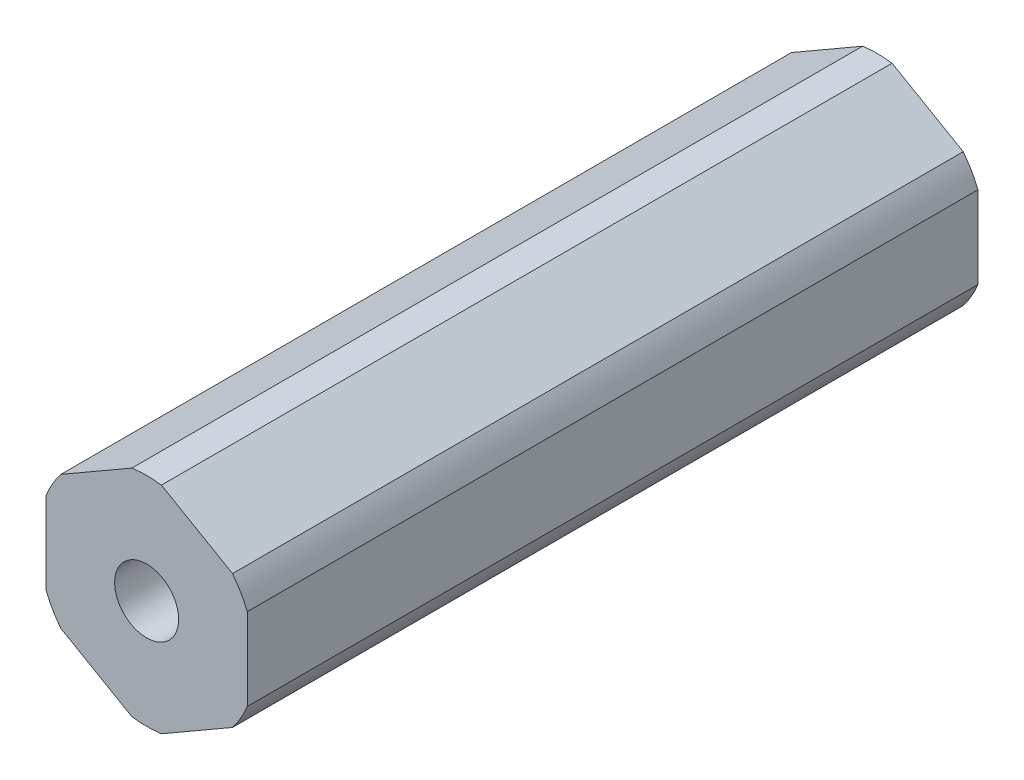
ISO-10303-21;
HEADER;
FILE_DESCRIPTION(('STEP AP214'),'2;1');
FILE_NAME('part.step','',(''),(''),'','','');
FILE_SCHEMA(('AUTOMOTIVE_DESIGN { 1 0 10303 214 1 1 1 1 }'));
ENDSEC;
DATA;
#1=APPLICATION_CONTEXT('core data for automotive mechanical design processes');
#2=APPLICATION_PROTOCOL_DEFINITION('international standard','automotive_design',2000,#1);
#3=PRODUCT_CONTEXT('',#1,'mechanical');
#4=PRODUCT('Part','Part','',(#3));
#5=PRODUCT_RELATED_PRODUCT_CATEGORY('part','',(#4));
#6=PRODUCT_DEFINITION_FORMATION('','',#4);
#7=PRODUCT_DEFINITION_CONTEXT('part definition',#1,'design');
#8=PRODUCT_DEFINITION('design','',#6,#7);
#9=PRODUCT_DEFINITION_SHAPE('','',#8);
#10=(LENGTH_UNIT() NAMED_UNIT(*) SI_UNIT(.MILLI.,.METRE.));
#11=(NAMED_UNIT(*) PLANE_ANGLE_UNIT() SI_UNIT($,.RADIAN.));
#12=(NAMED_UNIT(*) SI_UNIT($,.STERADIAN.) SOLID_ANGLE_UNIT());
#13=UNCERTAINTY_MEASURE_WITH_UNIT(LENGTH_MEASURE(1.E-05),#10,'distance_accuracy_value','');
#14=(GEOMETRIC_REPRESENTATION_CONTEXT(3) GLOBAL_UNCERTAINTY_ASSIGNED_CONTEXT((#13)) GLOBAL_UNIT_ASSIGNED_CONTEXT((#10,
#11,#12)) REPRESENTATION_CONTEXT('',''));
#15=CARTESIAN_POINT('',(0.,0.,0.));
#16=DIRECTION('',(0.,0.,1.));
#17=DIRECTION('',(1.,0.,0.));
#18=AXIS2_PLACEMENT_3D('',#15,#16,#17);
#19=CARTESIAN_POINT('',(0.,0.,46.101));
#20=DIRECTION('',(0.,0.,-1.));
#21=DIRECTION('',(-1.,0.,0.));
#22=AXIS2_PLACEMENT_3D('',#19,#20,#21);
#23=CYLINDRICAL_SURFACE('',#22,6.858);
#24=CARTESIAN_POINT('',(0.,0.,0.));
#25=DIRECTION('',(0.,0.,1.));
#26=DIRECTION('',(1.,0.,0.));
#27=AXIS2_PLACEMENT_3D('',#24,#25,#26);
#28=CIRCLE('',#27,6.858);
#29=CARTESIAN_POINT('',(-6.34999999999999,-2.59030191290516,0.));
#30=VERTEX_POINT('',#29);
#31=CARTESIAN_POINT('',(-5.41826726004726,-4.20411035757864,0.));
#32=VERTEX_POINT('',#31);
#33=EDGE_CURVE('E170',#30,#32,#28,.T.);
#34=ORIENTED_EDGE('',*,*,#33,.T.);
#35=DIRECTION('',(0.,0.,-1.));
#36=VECTOR('',#35,1.);
#37=CARTESIAN_POINT('',(-5.41826726004726,-4.20411035757864,46.101));
#38=LINE('',#37,#36);
#39=CARTESIAN_POINT('',(-5.41826726004726,-4.20411035757864,46.101));
#40=VERTEX_POINT('',#39);
#41=EDGE_CURVE('E11',#40,#32,#38,.T.);
#42=ORIENTED_EDGE('',*,*,#41,.F.);
#43=CARTESIAN_POINT('',(0.,0.,46.101));
#44=DIRECTION('',(0.,0.,1.));
#45=DIRECTION('',(1.,0.,0.));
#46=AXIS2_PLACEMENT_3D('',#43,#44,#45);
#47=CIRCLE('',#46,6.858);
#48=CARTESIAN_POINT('',(-6.34999999999999,-2.59030191290516,46.101));
#49=VERTEX_POINT('',#48);
#50=EDGE_CURVE('E205',#49,#40,#47,.T.);
#51=ORIENTED_EDGE('',*,*,#50,.F.);
#52=DIRECTION('',(0.,0.,-1.));
#53=VECTOR('',#52,1.);
#54=CARTESIAN_POINT('',(-6.34999999999999,-2.59030191290516,46.101));
#55=LINE('',#54,#53);
#56=EDGE_CURVE('E166',#49,#30,#55,.T.);
#57=ORIENTED_EDGE('',*,*,#56,.T.);
#58=EDGE_LOOP('',(#34,#42,#51,#57));
#59=FACE_BOUND('',#58,.T.);
#60=ADVANCED_FACE('F45',(#59),#23,.T.);
#61=CARTESIAN_POINT('',(-5.41826726004726,-4.20411035757864,46.101));
#62=DIRECTION('',(0.499999999999995,0.866025403784442,0.));
#63=DIRECTION('',(-0.866025403784442,0.499999999999995,0.));
#64=AXIS2_PLACEMENT_3D('',#61,#62,#63);
#65=PLANE('',#64);
#66=DIRECTION('',(0.866025403784442,-0.499999999999995,0.));
#67=VECTOR('',#66,1.);
#68=CARTESIAN_POINT('',(-5.41826726004726,-4.20411035757864,0.));
#69=LINE('',#68,#67);
#70=CARTESIAN_POINT('',(-0.931732739952676,-6.79441227048376,0.));
#71=VERTEX_POINT('',#70);
#72=EDGE_CURVE('E174',#32,#71,#69,.T.);
#73=ORIENTED_EDGE('',*,*,#72,.T.);
#74=DIRECTION('',(0.,0.,-1.));
#75=VECTOR('',#74,1.);
#76=CARTESIAN_POINT('',(-0.931732739952676,-6.79441227048376,46.101));
#77=LINE('',#76,#75);
#78=CARTESIAN_POINT('',(-0.931732739952676,-6.79441227048376,46.101));
#79=VERTEX_POINT('',#78);
#80=EDGE_CURVE('E54',#79,#71,#77,.T.);
#81=ORIENTED_EDGE('',*,*,#80,.F.);
#82=DIRECTION('',(0.866025403784442,-0.499999999999995,0.));
#83=VECTOR('',#82,1.);
#84=CARTESIAN_POINT('',(-5.41826726004726,-4.20411035757864,46.101));
#85=LINE('',#84,#83);
#86=EDGE_CURVE('E117',#40,#79,#85,.T.);
#87=ORIENTED_EDGE('',*,*,#86,.F.);
#88=ORIENTED_EDGE('',*,*,#41,.T.);
#89=EDGE_LOOP('',(#73,#81,#87,#88));
#90=FACE_BOUND('',#89,.T.);
#91=ADVANCED_FACE('F300',(#90),#65,.F.);
#92=CARTESIAN_POINT('',(0.,0.,46.101));
#93=DIRECTION('',(0.,0.,-1.));
#94=DIRECTION('',(-1.,0.,0.));
#95=AXIS2_PLACEMENT_3D('',#92,#93,#94);
#96=CYLINDRICAL_SURFACE('',#95,6.858);
#97=CARTESIAN_POINT('',(0.,0.,0.));
#98=DIRECTION('',(0.,0.,1.));
#99=DIRECTION('',(1.,0.,0.));
#100=AXIS2_PLACEMENT_3D('',#97,#98,#99);
#101=CIRCLE('',#100,6.858);
#102=CARTESIAN_POINT('',(0.931732739952767,-6.79441227048375,0.));
#103=VERTEX_POINT('',#102);
#104=EDGE_CURVE('E178',#71,#103,#101,.T.);
#105=ORIENTED_EDGE('',*,*,#104,.T.);
#106=DIRECTION('',(0.,0.,-1.));
#107=VECTOR('',#106,1.);
#108=CARTESIAN_POINT('',(0.931732739952767,-6.79441227048375,46.101));
#109=LINE('',#108,#107);
#110=CARTESIAN_POINT('',(0.931732739952767,-6.79441227048375,46.101));
#111=VERTEX_POINT('',#110);
#112=EDGE_CURVE('E232',#111,#103,#109,.T.);
#113=ORIENTED_EDGE('',*,*,#112,.F.);
#114=CARTESIAN_POINT('',(0.,0.,46.101));
#115=DIRECTION('',(0.,0.,1.));
#116=DIRECTION('',(1.,0.,0.));
#117=AXIS2_PLACEMENT_3D('',#114,#115,#116);
#118=CIRCLE('',#117,6.858);
#119=EDGE_CURVE('E242',#79,#111,#118,.T.);
#120=ORIENTED_EDGE('',*,*,#119,.F.);
#121=ORIENTED_EDGE('',*,*,#80,.T.);
#122=EDGE_LOOP('',(#105,#113,#120,#121));
#123=FACE_BOUND('',#122,.T.);
#124=ADVANCED_FACE('F240',(#123),#96,.T.);
#125=CARTESIAN_POINT('',(0.931732739952769,-6.79441227048375,46.101));
#126=DIRECTION('',(-0.500000000000007,0.866025403784435,0.));
#127=DIRECTION('',(-0.866025403784435,-0.500000000000007,0.));
#128=AXIS2_PLACEMENT_3D('',#125,#126,#127);
#129=PLANE('',#128);
#130=DIRECTION('',(0.866025403784434,0.500000000000007,0.));
#131=VECTOR('',#130,1.);
#132=CARTESIAN_POINT('',(0.931732739952769,-6.79441227048375,0.));
#133=LINE('',#132,#131);
#134=CARTESIAN_POINT('',(5.41826726004732,-4.20411035757856,0.));
#135=VERTEX_POINT('',#134);
#136=EDGE_CURVE('E181',#103,#135,#133,.T.);
#137=ORIENTED_EDGE('',*,*,#136,.T.);
#138=DIRECTION('',(0.,0.,-1.));
#139=VECTOR('',#138,1.);
#140=CARTESIAN_POINT('',(5.41826726004732,-4.20411035757856,46.101));
#141=LINE('',#140,#139);
#142=CARTESIAN_POINT('',(5.41826726004732,-4.20411035757856,46.101));
#143=VERTEX_POINT('',#142);
#144=EDGE_CURVE('E228',#143,#135,#141,.T.);
#145=ORIENTED_EDGE('',*,*,#144,.F.);
#146=DIRECTION('',(0.866025403784434,0.500000000000007,0.));
#147=VECTOR('',#146,1.);
#148=CARTESIAN_POINT('',(0.931732739952769,-6.79441227048375,46.101));
#149=LINE('',#148,#147);
#150=EDGE_CURVE('E261',#111,#143,#149,.T.);
#151=ORIENTED_EDGE('',*,*,#150,.F.);
#152=ORIENTED_EDGE('',*,*,#112,.T.);
#153=EDGE_LOOP('',(#137,#145,#151,#152));
#154=FACE_BOUND('',#153,.T.);
#155=ADVANCED_FACE('F251',(#154),#129,.F.);
#156=CARTESIAN_POINT('',(0.,0.,46.101));
#157=DIRECTION('',(0.,0.,-1.));
#158=DIRECTION('',(-1.,0.,0.));
#159=AXIS2_PLACEMENT_3D('',#156,#157,#158);
#160=CYLINDRICAL_SURFACE('',#159,6.858);
#161=CARTESIAN_POINT('',(0.,0.,0.));
#162=DIRECTION('',(0.,0.,1.));
#163=DIRECTION('',(1.,0.,0.));
#164=AXIS2_PLACEMENT_3D('',#161,#162,#163);
#165=CIRCLE('',#164,6.858);
#166=CARTESIAN_POINT('',(6.35000000000002,-2.59030191290508,0.));
#167=VERTEX_POINT('',#166);
#168=EDGE_CURVE('E184',#135,#167,#165,.T.);
#169=ORIENTED_EDGE('',*,*,#168,.T.);
#170=DIRECTION('',(0.,0.,-1.));
#171=VECTOR('',#170,1.);
#172=CARTESIAN_POINT('',(6.35000000000002,-2.59030191290508,46.101));
#173=LINE('',#172,#171);
#174=CARTESIAN_POINT('',(6.35000000000002,-2.59030191290508,46.101));
#175=VERTEX_POINT('',#174);
#176=EDGE_CURVE('E224',#175,#167,#173,.T.);
#177=ORIENTED_EDGE('',*,*,#176,.F.);
#178=CARTESIAN_POINT('',(0.,0.,46.101));
#179=DIRECTION('',(0.,0.,1.));
#180=DIRECTION('',(1.,0.,0.));
#181=AXIS2_PLACEMENT_3D('',#178,#179,#180);
#182=CIRCLE('',#181,6.858);
#183=EDGE_CURVE('E257',#143,#175,#182,.T.);
#184=ORIENTED_EDGE('',*,*,#183,.F.);
#185=ORIENTED_EDGE('',*,*,#144,.T.);
#186=EDGE_LOOP('',(#169,#177,#184,#185));
#187=FACE_BOUND('',#186,.T.);
#188=ADVANCED_FACE('F255',(#187),#160,.T.);
#189=CARTESIAN_POINT('',(6.35000000000002,-2.59030191290508,46.101));
#190=DIRECTION('',(-1.,0.,0.));
#191=DIRECTION('',(0.,-1.,0.));
#192=AXIS2_PLACEMENT_3D('',#189,#190,#191);
#193=PLANE('',#192);
#194=DIRECTION('',(0.,1.,0.));
#195=VECTOR('',#194,1.);
#196=CARTESIAN_POINT('',(6.35000000000002,-2.59030191290508,0.));
#197=LINE('',#196,#195);
#198=CARTESIAN_POINT('',(6.34999999999997,2.59030191290521,0.));
#199=VERTEX_POINT('',#198);
#200=EDGE_CURVE('E187',#167,#199,#197,.T.);
#201=ORIENTED_EDGE('',*,*,#200,.T.);
#202=DIRECTION('',(0.,0.,-1.));
#203=VECTOR('',#202,1.);
#204=CARTESIAN_POINT('',(6.34999999999997,2.59030191290521,46.101));
#205=LINE('',#204,#203);
#206=CARTESIAN_POINT('',(6.34999999999997,2.59030191290521,46.101));
#207=VERTEX_POINT('',#206);
#208=EDGE_CURVE('E220',#207,#199,#205,.T.);
#209=ORIENTED_EDGE('',*,*,#208,.F.);
#210=DIRECTION('',(0.,1.,0.));
#211=VECTOR('',#210,1.);
#212=CARTESIAN_POINT('',(6.35000000000002,-2.59030191290508,46.101));
#213=LINE('',#212,#211);
#214=EDGE_CURVE('E260',#175,#207,#213,.T.);
#215=ORIENTED_EDGE('',*,*,#214,.F.);
#216=ORIENTED_EDGE('',*,*,#176,.T.);
#217=EDGE_LOOP('',(#201,#209,#215,#216));
#218=FACE_BOUND('',#217,.T.);
#219=ADVANCED_FACE('F313',(#218),#193,.F.);
#220=CARTESIAN_POINT('',(0.,0.,46.101));
#221=DIRECTION('',(0.,0.,-1.));
#222=DIRECTION('',(-1.,0.,0.));
#223=AXIS2_PLACEMENT_3D('',#220,#221,#222);
#224=CYLINDRICAL_SURFACE('',#223,6.858);
#225=CARTESIAN_POINT('',(0.,0.,0.));
#226=DIRECTION('',(0.,0.,1.));
#227=DIRECTION('',(1.,0.,0.));
#228=AXIS2_PLACEMENT_3D('',#225,#226,#227);
#229=CIRCLE('',#228,6.858);
#230=CARTESIAN_POINT('',(5.41826726004721,4.2041103575787,0.));
#231=VERTEX_POINT('',#230);
#232=EDGE_CURVE('E190',#199,#231,#229,.T.);
#233=ORIENTED_EDGE('',*,*,#232,.T.);
#234=DIRECTION('',(0.,0.,-1.));
#235=VECTOR('',#234,1.);
#236=CARTESIAN_POINT('',(5.41826726004721,4.2041103575787,46.101));
#237=LINE('',#236,#235);
#238=CARTESIAN_POINT('',(5.41826726004721,4.2041103575787,46.101));
#239=VERTEX_POINT('',#238);
#240=EDGE_CURVE('E216',#239,#231,#237,.T.);
#241=ORIENTED_EDGE('',*,*,#240,.F.);
#242=CARTESIAN_POINT('',(0.,0.,46.101));
#243=DIRECTION('',(0.,0.,1.));
#244=DIRECTION('',(1.,0.,0.));
#245=AXIS2_PLACEMENT_3D('',#242,#243,#244);
#246=CIRCLE('',#245,6.858);
#247=EDGE_CURVE('E265',#207,#239,#246,.T.);
#248=ORIENTED_EDGE('',*,*,#247,.F.);
#249=ORIENTED_EDGE('',*,*,#208,.T.);
#250=EDGE_LOOP('',(#233,#241,#248,#249));
#251=FACE_BOUND('',#250,.T.);
#252=ADVANCED_FACE('F316',(#251),#224,.T.);
#253=CARTESIAN_POINT('',(5.41826726004722,4.2041103575787,46.101));
#254=DIRECTION('',(-0.499999999999995,-0.866025403784442,0.));
#255=DIRECTION('',(0.866025403784442,-0.499999999999995,0.));
#256=AXIS2_PLACEMENT_3D('',#253,#254,#255);
#257=PLANE('',#256);
#258=DIRECTION('',(-0.866025403784442,0.499999999999995,0.));
#259=VECTOR('',#258,1.);
#260=CARTESIAN_POINT('',(5.41826726004722,4.2041103575787,0.));
#261=LINE('',#260,#259);
#262=CARTESIAN_POINT('',(0.931732739952745,6.79441227048375,0.));
#263=VERTEX_POINT('',#262);
#264=EDGE_CURVE('E193',#231,#263,#261,.T.);
#265=ORIENTED_EDGE('',*,*,#264,.T.);
#266=DIRECTION('',(0.,0.,-1.));
#267=VECTOR('',#266,1.);
#268=CARTESIAN_POINT('',(0.931732739952745,6.79441227048375,46.101));
#269=LINE('',#268,#267);
#270=CARTESIAN_POINT('',(0.931732739952745,6.79441227048375,46.101));
#271=VERTEX_POINT('',#270);
#272=EDGE_CURVE('E212',#271,#263,#269,.T.);
#273=ORIENTED_EDGE('',*,*,#272,.F.);
#274=DIRECTION('',(-0.866025403784442,0.499999999999995,0.));
#275=VECTOR('',#274,1.);
#276=CARTESIAN_POINT('',(5.41826726004722,4.2041103575787,46.101));
#277=LINE('',#276,#275);
#278=EDGE_CURVE('E272',#239,#271,#277,.T.);
#279=ORIENTED_EDGE('',*,*,#278,.F.);
#280=ORIENTED_EDGE('',*,*,#240,.T.);
#281=EDGE_LOOP('',(#265,#273,#279,#280));
#282=FACE_BOUND('',#281,.T.);
#283=ADVANCED_FACE('F280',(#282),#257,.F.);
#284=CARTESIAN_POINT('',(0.,0.,46.101));
#285=DIRECTION('',(0.,0.,-1.));
#286=DIRECTION('',(-1.,0.,0.));
#287=AXIS2_PLACEMENT_3D('',#284,#285,#286);
#288=CYLINDRICAL_SURFACE('',#287,6.858);
#289=CARTESIAN_POINT('',(0.,0.,0.));
#290=DIRECTION('',(0.,0.,1.));
#291=DIRECTION('',(1.,0.,0.));
#292=AXIS2_PLACEMENT_3D('',#289,#290,#291);
#293=CIRCLE('',#292,6.858);
#294=CARTESIAN_POINT('',(-0.931732739952723,6.79441227048375,0.));
#295=VERTEX_POINT('',#294);
#296=EDGE_CURVE('E196',#263,#295,#293,.T.);
#297=ORIENTED_EDGE('',*,*,#296,.T.);
#298=DIRECTION('',(0.,0.,-1.));
#299=VECTOR('',#298,1.);
#300=CARTESIAN_POINT('',(-0.931732739952723,6.79441227048375,46.101));
#301=LINE('',#300,#299);
#302=CARTESIAN_POINT('',(-0.931732739952723,6.79441227048375,46.101));
#303=VERTEX_POINT('',#302);
#304=EDGE_CURVE('E159',#303,#295,#301,.T.);
#305=ORIENTED_EDGE('',*,*,#304,.F.);
#306=CARTESIAN_POINT('',(0.,0.,46.101));
#307=DIRECTION('',(0.,0.,1.));
#308=DIRECTION('',(1.,0.,0.));
#309=AXIS2_PLACEMENT_3D('',#306,#307,#308);
#310=CIRCLE('',#309,6.858);
#311=EDGE_CURVE('E148',#271,#303,#310,.T.);
#312=ORIENTED_EDGE('',*,*,#311,.F.);
#313=ORIENTED_EDGE('',*,*,#272,.T.);
#314=EDGE_LOOP('',(#297,#305,#312,#313));
#315=FACE_BOUND('',#314,.T.);
#316=ADVANCED_FACE('F284',(#315),#288,.T.);
#317=CARTESIAN_POINT('',(-0.931732739952723,6.79441227048375,46.101));
#318=DIRECTION('',(0.500000000000001,-0.866025403784438,0.));
#319=DIRECTION('',(0.866025403784438,0.500000000000001,0.));
#320=AXIS2_PLACEMENT_3D('',#317,#318,#319);
#321=PLANE('',#320);
#322=DIRECTION('',(-0.866025403784438,-0.500000000000001,0.));
#323=VECTOR('',#322,1.);
#324=CARTESIAN_POINT('',(-0.931732739952723,6.79441227048375,0.));
#325=LINE('',#324,#323);
#326=CARTESIAN_POINT('',(-5.41826726004729,4.2041103575786,0.));
#327=VERTEX_POINT('',#326);
#328=EDGE_CURVE('E157',#295,#327,#325,.T.);
#329=ORIENTED_EDGE('',*,*,#328,.T.);
#330=DIRECTION('',(0.,0.,-1.));
#331=VECTOR('',#330,1.);
#332=CARTESIAN_POINT('',(-5.41826726004729,4.2041103575786,46.101));
#333=LINE('',#332,#331);
#334=CARTESIAN_POINT('',(-5.41826726004729,4.2041103575786,46.101));
#335=VERTEX_POINT('',#334);
#336=EDGE_CURVE('E154',#335,#327,#333,.T.);
#337=ORIENTED_EDGE('',*,*,#336,.F.);
#338=DIRECTION('',(-0.866025403784438,-0.500000000000001,0.));
#339=VECTOR('',#338,1.);
#340=CARTESIAN_POINT('',(-0.931732739952723,6.79441227048375,46.101));
#341=LINE('',#340,#339);
#342=EDGE_CURVE('E142',#303,#335,#341,.T.);
#343=ORIENTED_EDGE('',*,*,#342,.F.);
#344=ORIENTED_EDGE('',*,*,#304,.T.);
#345=EDGE_LOOP('',(#329,#337,#343,#344));
#346=FACE_BOUND('',#345,.T.);
#347=ADVANCED_FACE('F155',(#346),#321,.F.);
#348=CARTESIAN_POINT('',(0.,0.,46.101));
#349=DIRECTION('',(0.,0.,-1.));
#350=DIRECTION('',(-1.,0.,0.));
#351=AXIS2_PLACEMENT_3D('',#348,#349,#350);
#352=CYLINDRICAL_SURFACE('',#351,6.858);
#353=CARTESIAN_POINT('',(0.,0.,0.));
#354=DIRECTION('',(0.,0.,1.));
#355=DIRECTION('',(1.,0.,0.));
#356=AXIS2_PLACEMENT_3D('',#353,#354,#355);
#357=CIRCLE('',#356,6.858);
#358=CARTESIAN_POINT('',(-6.35000000000001,2.59030191290512,0.));
#359=VERTEX_POINT('',#358);
#360=EDGE_CURVE('E103',#327,#359,#357,.T.);
#361=ORIENTED_EDGE('',*,*,#360,.T.);
#362=DIRECTION('',(0.,0.,-1.));
#363=VECTOR('',#362,1.);
#364=CARTESIAN_POINT('',(-6.35000000000001,2.59030191290512,46.101));
#365=LINE('',#364,#363);
#366=CARTESIAN_POINT('',(-6.35000000000001,2.59030191290512,46.101));
#367=VERTEX_POINT('',#366);
#368=EDGE_CURVE('E160',#367,#359,#365,.T.);
#369=ORIENTED_EDGE('',*,*,#368,.F.);
#370=CARTESIAN_POINT('',(0.,0.,46.101));
#371=DIRECTION('',(0.,0.,1.));
#372=DIRECTION('',(1.,0.,0.));
#373=AXIS2_PLACEMENT_3D('',#370,#371,#372);
#374=CIRCLE('',#373,6.858);
#375=EDGE_CURVE('E146',#335,#367,#374,.T.);
#376=ORIENTED_EDGE('',*,*,#375,.F.);
#377=ORIENTED_EDGE('',*,*,#336,.T.);
#378=EDGE_LOOP('',(#361,#369,#376,#377));
#379=FACE_BOUND('',#378,.T.);
#380=ADVANCED_FACE('F162',(#379),#352,.T.);
#381=CARTESIAN_POINT('',(-6.35000000000001,2.59030191290512,46.101));
#382=DIRECTION('',(1.,0.,0.));
#383=DIRECTION('',(0.,1.,0.));
#384=AXIS2_PLACEMENT_3D('',#381,#382,#383);
#385=PLANE('',#384);
#386=DIRECTION('',(0.,-1.,0.));
#387=VECTOR('',#386,1.);
#388=CARTESIAN_POINT('',(-6.35000000000001,2.59030191290512,0.));
#389=LINE('',#388,#387);
#390=EDGE_CURVE('E109',#359,#30,#389,.T.);
#391=ORIENTED_EDGE('',*,*,#390,.T.);
#392=ORIENTED_EDGE('',*,*,#56,.F.);
#393=DIRECTION('',(0.,-1.,0.));
#394=VECTOR('',#393,1.);
#395=CARTESIAN_POINT('',(-6.35000000000001,2.59030191290512,46.101));
#396=LINE('',#395,#394);
#397=EDGE_CURVE('E62',#367,#49,#396,.T.);
#398=ORIENTED_EDGE('',*,*,#397,.F.);
#399=ORIENTED_EDGE('',*,*,#368,.T.);
#400=EDGE_LOOP('',(#391,#392,#398,#399));
#401=FACE_BOUND('',#400,.T.);
#402=ADVANCED_FACE('F288',(#401),#385,.F.);
#403=CARTESIAN_POINT('',(0.,0.,46.101));
#404=DIRECTION('',(0.,0.,1.));
#405=DIRECTION('',(1.,0.,0.));
#406=AXIS2_PLACEMENT_3D('',#403,#404,#405);
#407=PLANE('',#406);
#408=CARTESIAN_POINT('',(0.,0.,46.101));
#409=DIRECTION('',(0.,0.,1.));
#410=DIRECTION('',(1.,0.,0.));
#411=AXIS2_PLACEMENT_3D('',#408,#409,#410);
#412=CIRCLE('',#411,2.0193);
#413=CARTESIAN_POINT('',(2.0193,0.,46.101));
#414=VERTEX_POINT('',#413);
#415=EDGE_CURVE('E372',#414,#414,#412,.T.);
#416=ORIENTED_EDGE('',*,*,#415,.F.);
#417=EDGE_LOOP('',(#416));
#418=FACE_BOUND('',#417,.T.);
#419=ORIENTED_EDGE('',*,*,#50,.T.);
#420=ORIENTED_EDGE('',*,*,#86,.T.);
#421=ORIENTED_EDGE('',*,*,#119,.T.);
#422=ORIENTED_EDGE('',*,*,#150,.T.);
#423=ORIENTED_EDGE('',*,*,#183,.T.);
#424=ORIENTED_EDGE('',*,*,#214,.T.);
#425=ORIENTED_EDGE('',*,*,#247,.T.);
#426=ORIENTED_EDGE('',*,*,#278,.T.);
#427=ORIENTED_EDGE('',*,*,#311,.T.);
#428=ORIENTED_EDGE('',*,*,#342,.T.);
#429=ORIENTED_EDGE('',*,*,#375,.T.);
#430=ORIENTED_EDGE('',*,*,#397,.T.);
#431=EDGE_LOOP('',(#419,#420,#421,#422,#423,#424,#425,#426,#427,#428,#429,#430));
#432=FACE_BOUND('',#431,.T.);
#433=ADVANCED_FACE('F144',(#418,#432),#407,.T.);
#434=CARTESIAN_POINT('',(0.,0.,0.));
#435=DIRECTION('',(0.,0.,1.));
#436=DIRECTION('',(1.,0.,0.));
#437=AXIS2_PLACEMENT_3D('',#434,#435,#436);
#438=PLANE('',#437);
#439=CARTESIAN_POINT('',(0.,0.,0.));
#440=DIRECTION('',(0.,0.,1.));
#441=DIRECTION('',(1.,0.,0.));
#442=AXIS2_PLACEMENT_3D('',#439,#440,#441);
#443=CIRCLE('',#442,2.0193);
#444=CARTESIAN_POINT('',(2.0193,0.,0.));
#445=VERTEX_POINT('',#444);
#446=EDGE_CURVE('E175',#445,#445,#443,.T.);
#447=ORIENTED_EDGE('',*,*,#446,.T.);
#448=EDGE_LOOP('',(#447));
#449=FACE_BOUND('',#448,.T.);
#450=ORIENTED_EDGE('',*,*,#33,.F.);
#451=ORIENTED_EDGE('',*,*,#390,.F.);
#452=ORIENTED_EDGE('',*,*,#360,.F.);
#453=ORIENTED_EDGE('',*,*,#328,.F.);
#454=ORIENTED_EDGE('',*,*,#296,.F.);
#455=ORIENTED_EDGE('',*,*,#264,.F.);
#456=ORIENTED_EDGE('',*,*,#232,.F.);
#457=ORIENTED_EDGE('',*,*,#200,.F.);
#458=ORIENTED_EDGE('',*,*,#168,.F.);
#459=ORIENTED_EDGE('',*,*,#136,.F.);
#460=ORIENTED_EDGE('',*,*,#104,.F.);
#461=ORIENTED_EDGE('',*,*,#72,.F.);
#462=EDGE_LOOP('',(#450,#451,#452,#453,#454,#455,#456,#457,#458,#459,#460,#461));
#463=FACE_BOUND('',#462,.T.);
#464=ADVANCED_FACE('F246',(#449,#463),#438,.F.);
#465=CARTESIAN_POINT('',(0.,0.,0.));
#466=DIRECTION('',(0.,0.,1.));
#467=DIRECTION('',(1.,0.,0.));
#468=AXIS2_PLACEMENT_3D('',#465,#466,#467);
#469=CYLINDRICAL_SURFACE('',#468,2.0193);
#470=ORIENTED_EDGE('',*,*,#446,.F.);
#471=EDGE_LOOP('',(#470));
#472=FACE_BOUND('',#471,.T.);
#473=ORIENTED_EDGE('',*,*,#415,.T.);
#474=EDGE_LOOP('',(#473));
#475=FACE_BOUND('',#474,.T.);
#476=ADVANCED_FACE('F355',(#472,#475),#469,.F.);
#477=CLOSED_SHELL('',(#60,#91,#124,#155,#188,#219,#252,#283,#316,#347,#380,#402,#433,#464,#476));
#478=MANIFOLD_SOLID_BREP('B2',#477);
#479=ADVANCED_BREP_SHAPE_REPRESENTATION('',(#18,#478),#14);
#480=SHAPE_DEFINITION_REPRESENTATION(#9,#479);
ENDSEC;
END-ISO-10303-21;
